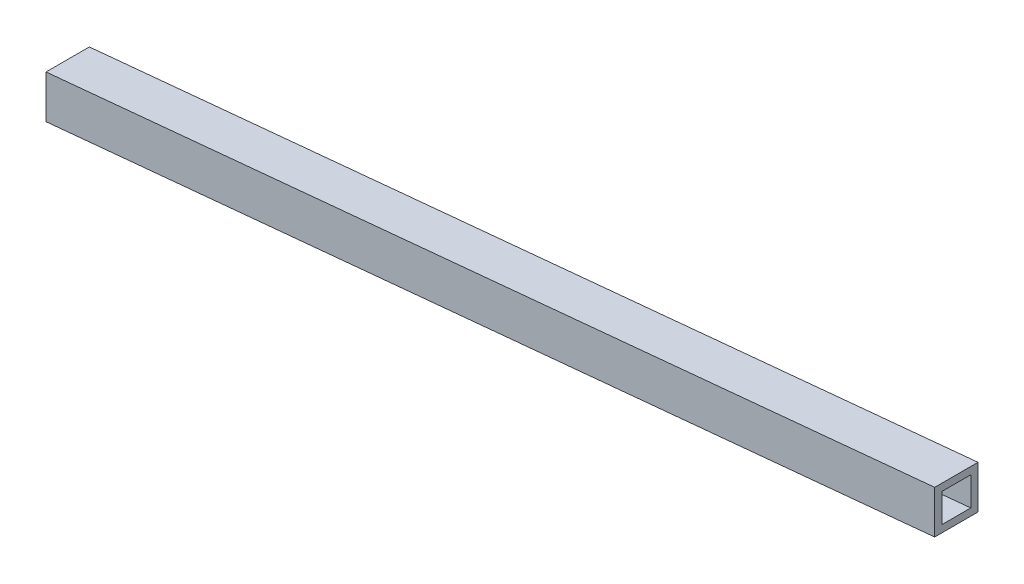
ISO-10303-21;
HEADER;
FILE_DESCRIPTION(('STEP AP214'),'2;1');
FILE_NAME('part.step','',(''),(''),'','','');
FILE_SCHEMA(('AUTOMOTIVE_DESIGN { 1 0 10303 214 1 1 1 1 }'));
ENDSEC;
DATA;
#1=APPLICATION_CONTEXT('core data for automotive mechanical design processes');
#2=APPLICATION_PROTOCOL_DEFINITION('international standard','automotive_design',2000,#1);
#3=PRODUCT_CONTEXT('',#1,'mechanical');
#4=PRODUCT('Part','Part','',(#3));
#5=PRODUCT_RELATED_PRODUCT_CATEGORY('part','',(#4));
#6=PRODUCT_DEFINITION_FORMATION('','',#4);
#7=PRODUCT_DEFINITION_CONTEXT('part definition',#1,'design');
#8=PRODUCT_DEFINITION('design','',#6,#7);
#9=PRODUCT_DEFINITION_SHAPE('','',#8);
#10=(LENGTH_UNIT() NAMED_UNIT(*) SI_UNIT(.MILLI.,.METRE.));
#11=(NAMED_UNIT(*) PLANE_ANGLE_UNIT() SI_UNIT($,.RADIAN.));
#12=(NAMED_UNIT(*) SI_UNIT($,.STERADIAN.) SOLID_ANGLE_UNIT());
#13=UNCERTAINTY_MEASURE_WITH_UNIT(LENGTH_MEASURE(1.E-05),#10,'distance_accuracy_value','');
#14=(GEOMETRIC_REPRESENTATION_CONTEXT(3) GLOBAL_UNCERTAINTY_ASSIGNED_CONTEXT((#13)) GLOBAL_UNIT_ASSIGNED_CONTEXT((#10,
#11,#12)) REPRESENTATION_CONTEXT('',''));
#15=CARTESIAN_POINT('',(0.,0.,0.));
#16=DIRECTION('',(0.,0.,1.));
#17=DIRECTION('',(1.,0.,0.));
#18=AXIS2_PLACEMENT_3D('',#15,#16,#17);
#19=CARTESIAN_POINT('',(0.,3.175,0.));
#20=DIRECTION('',(0.,1.,0.));
#21=DIRECTION('',(0.,0.,1.));
#22=AXIS2_PLACEMENT_3D('',#19,#20,#21);
#23=PLANE('',#22);
#24=DIRECTION('',(0.994505452921406,0.,-0.104684784518043));
#25=VECTOR('',#24,1.);
#26=CARTESIAN_POINT('',(-0.332374190844786,3.175,-3.15755481302547));
#27=LINE('',#26,#25);
#28=CARTESIAN_POINT('',(0.,3.175,-3.1925415699565));
#29=VERTEX_POINT('',#28);
#30=CARTESIAN_POINT('',(355.6,3.175,-40.624120517325));
#31=VERTEX_POINT('',#30);
#32=EDGE_CURVE('E80',#29,#31,#27,.T.);
#33=ORIENTED_EDGE('',*,*,#32,.T.);
#34=DIRECTION('',(0.,0.,1.));
#35=VECTOR('',#34,1.);
#36=CARTESIAN_POINT('',(355.6,3.175,0.));
#37=LINE('',#36,#35);
#38=CARTESIAN_POINT('',(355.6,3.175,-53.394286797151));
#39=VERTEX_POINT('',#38);
#40=EDGE_CURVE('E179',#39,#31,#37,.T.);
#41=ORIENTED_EDGE('',*,*,#40,.F.);
#42=DIRECTION('',(-0.994505452921406,0.,0.104684784518043));
#43=VECTOR('',#42,1.);
#44=CARTESIAN_POINT('',(-1.66187095422393,3.175,-15.7877740651273));
#45=LINE('',#44,#43);
#46=CARTESIAN_POINT('',(0.,3.175,-15.9627078497824));
#47=VERTEX_POINT('',#46);
#48=EDGE_CURVE('E168',#39,#47,#45,.T.);
#49=ORIENTED_EDGE('',*,*,#48,.T.);
#50=DIRECTION('',(0.,0.,-1.));
#51=VECTOR('',#50,1.);
#52=CARTESIAN_POINT('',(0.,3.175,0.));
#53=LINE('',#52,#51);
#54=EDGE_CURVE('E66',#29,#47,#53,.T.);
#55=ORIENTED_EDGE('',*,*,#54,.F.);
#56=EDGE_LOOP('',(#33,#41,#49,#55));
#57=FACE_BOUND('',#56,.T.);
#58=ADVANCED_FACE('F62',(#57),#23,.T.);
#59=CARTESIAN_POINT('',(0.,3.175,0.));
#60=DIRECTION('',(0.104684784518043,0.,0.994505452921406));
#61=DIRECTION('',(0.994505452921406,0.,-0.104684784518043));
#62=AXIS2_PLACEMENT_3D('',#59,#60,#61);
#63=PLANE('',#62);
#64=DIRECTION('',(-0.994505452921406,0.,0.104684784518043));
#65=VECTOR('',#64,1.);
#66=CARTESIAN_POINT('',(0.,0.,0.));
#67=LINE('',#66,#65);
#68=CARTESIAN_POINT('',(355.6,0.,-37.4315789473684));
#69=VERTEX_POINT('',#68);
#70=CARTESIAN_POINT('',(0.,0.,0.));
#71=VERTEX_POINT('',#70);
#72=EDGE_CURVE('E133',#69,#71,#67,.T.);
#73=ORIENTED_EDGE('',*,*,#72,.F.);
#74=DIRECTION('',(0.,-1.,0.));
#75=VECTOR('',#74,1.);
#76=CARTESIAN_POINT('',(355.6,3.175,-37.4315789473684));
#77=LINE('',#76,#75);
#78=CARTESIAN_POINT('',(355.6,19.05,-37.4315789473684));
#79=VERTEX_POINT('',#78);
#80=EDGE_CURVE('E12',#79,#69,#77,.T.);
#81=ORIENTED_EDGE('',*,*,#80,.F.);
#82=DIRECTION('',(0.994505452921406,0.,-0.104684784518043));
#83=VECTOR('',#82,1.);
#84=CARTESIAN_POINT('',(0.,19.05,0.));
#85=LINE('',#84,#83);
#86=CARTESIAN_POINT('',(0.,19.05,0.));
#87=VERTEX_POINT('',#86);
#88=EDGE_CURVE('E131',#87,#79,#85,.T.);
#89=ORIENTED_EDGE('',*,*,#88,.F.);
#90=DIRECTION('',(0.,-1.,0.));
#91=VECTOR('',#90,1.);
#92=CARTESIAN_POINT('',(0.,3.175,0.));
#93=LINE('',#92,#91);
#94=EDGE_CURVE('E200',#87,#71,#93,.T.);
#95=ORIENTED_EDGE('',*,*,#94,.T.);
#96=EDGE_LOOP('',(#73,#81,#89,#95));
#97=FACE_BOUND('',#96,.T.);
#98=ADVANCED_FACE('F64',(#97),#63,.T.);
#99=CARTESIAN_POINT('',(355.6,3.175,0.));
#100=DIRECTION('',(1.,0.,0.));
#101=DIRECTION('',(0.,0.,-1.));
#102=AXIS2_PLACEMENT_3D('',#99,#100,#101);
#103=PLANE('',#102);
#104=DIRECTION('',(0.,-1.,0.));
#105=VECTOR('',#104,1.);
#106=CARTESIAN_POINT('',(355.6,3.175,-56.5868283671075));
#107=LINE('',#106,#105);
#108=CARTESIAN_POINT('',(355.6,19.05,-56.5868283671075));
#109=VERTEX_POINT('',#108);
#110=CARTESIAN_POINT('',(355.6,0.,-56.5868283671075));
#111=VERTEX_POINT('',#110);
#112=EDGE_CURVE('E72',#109,#111,#107,.T.);
#113=ORIENTED_EDGE('',*,*,#112,.F.);
#114=DIRECTION('',(0.,0.,-1.));
#115=VECTOR('',#114,1.);
#116=CARTESIAN_POINT('',(355.6,19.05,-56.5868283671075));
#117=LINE('',#116,#115);
#118=EDGE_CURVE('E138',#79,#109,#117,.T.);
#119=ORIENTED_EDGE('',*,*,#118,.F.);
#120=ORIENTED_EDGE('',*,*,#80,.T.);
#121=DIRECTION('',(0.,0.,1.));
#122=VECTOR('',#121,1.);
#123=CARTESIAN_POINT('',(355.6,0.,0.));
#124=LINE('',#123,#122);
#125=EDGE_CURVE('E187',#111,#69,#124,.T.);
#126=ORIENTED_EDGE('',*,*,#125,.F.);
#127=EDGE_LOOP('',(#113,#119,#120,#126));
#128=FACE_BOUND('',#127,.T.);
#129=DIRECTION('',(0.,0.,-1.));
#130=VECTOR('',#129,1.);
#131=CARTESIAN_POINT('',(355.6,15.875,-56.5868283671075));
#132=LINE('',#131,#130);
#133=CARTESIAN_POINT('',(355.6,15.875,-40.624120517325));
#134=VERTEX_POINT('',#133);
#135=CARTESIAN_POINT('',(355.6,15.875,-53.394286797151));
#136=VERTEX_POINT('',#135);
#137=EDGE_CURVE('E153',#134,#136,#132,.T.);
#138=ORIENTED_EDGE('',*,*,#137,.T.);
#139=DIRECTION('',(0.,-1.,0.));
#140=VECTOR('',#139,1.);
#141=CARTESIAN_POINT('',(355.6,15.875,-53.394286797151));
#142=LINE('',#141,#140);
#143=EDGE_CURVE('E181',#136,#39,#142,.T.);
#144=ORIENTED_EDGE('',*,*,#143,.T.);
#145=ORIENTED_EDGE('',*,*,#40,.T.);
#146=DIRECTION('',(0.,-1.,0.));
#147=VECTOR('',#146,1.);
#148=CARTESIAN_POINT('',(355.6,15.875,-40.624120517325));
#149=LINE('',#148,#147);
#150=EDGE_CURVE('E163',#134,#31,#149,.T.);
#151=ORIENTED_EDGE('',*,*,#150,.F.);
#152=EDGE_LOOP('',(#138,#144,#145,#151));
#153=FACE_BOUND('',#152,.T.);
#154=ADVANCED_FACE('F139',(#128,#153),#103,.T.);
#155=CARTESIAN_POINT('',(-1.99424514506872,3.175,-18.9453288781528));
#156=DIRECTION('',(-0.104684784518043,0.,-0.994505452921406));
#157=DIRECTION('',(-0.994505452921406,0.,0.104684784518043));
#158=AXIS2_PLACEMENT_3D('',#155,#156,#157);
#159=PLANE('',#158);
#160=DIRECTION('',(0.994505452921406,0.,-0.104684784518043));
#161=VECTOR('',#160,1.);
#162=CARTESIAN_POINT('',(-1.99424514506872,0.,-18.9453288781528));
#163=LINE('',#162,#161);
#164=CARTESIAN_POINT('',(0.,0.,-19.155249419739));
#165=VERTEX_POINT('',#164);
#166=EDGE_CURVE('E192',#165,#111,#163,.T.);
#167=ORIENTED_EDGE('',*,*,#166,.F.);
#168=DIRECTION('',(0.,-1.,0.));
#169=VECTOR('',#168,1.);
#170=CARTESIAN_POINT('',(0.,3.175,-19.155249419739));
#171=LINE('',#170,#169);
#172=CARTESIAN_POINT('',(0.,19.05,-19.155249419739));
#173=VERTEX_POINT('',#172);
#174=EDGE_CURVE('E202',#173,#165,#171,.T.);
#175=ORIENTED_EDGE('',*,*,#174,.F.);
#176=DIRECTION('',(-0.994505452921406,0.,0.104684784518043));
#177=VECTOR('',#176,1.);
#178=CARTESIAN_POINT('',(355.6,19.05,-56.5868283671075));
#179=LINE('',#178,#177);
#180=EDGE_CURVE('E144',#109,#173,#179,.T.);
#181=ORIENTED_EDGE('',*,*,#180,.F.);
#182=ORIENTED_EDGE('',*,*,#112,.T.);
#183=EDGE_LOOP('',(#167,#175,#181,#182));
#184=FACE_BOUND('',#183,.T.);
#185=ADVANCED_FACE('F206',(#184),#159,.T.);
#186=CARTESIAN_POINT('',(0.,3.175,0.));
#187=DIRECTION('',(-1.,0.,0.));
#188=DIRECTION('',(0.,0.,1.));
#189=AXIS2_PLACEMENT_3D('',#186,#187,#188);
#190=PLANE('',#189);
#191=DIRECTION('',(0.,-1.,0.));
#192=VECTOR('',#191,1.);
#193=CARTESIAN_POINT('',(0.,15.875,-15.9627078497824));
#194=LINE('',#193,#192);
#195=CARTESIAN_POINT('',(0.,15.875,-15.9627078497824));
#196=VERTEX_POINT('',#195);
#197=EDGE_CURVE('E171',#196,#47,#194,.T.);
#198=ORIENTED_EDGE('',*,*,#197,.F.);
#199=DIRECTION('',(0.,0.,1.));
#200=VECTOR('',#199,1.);
#201=CARTESIAN_POINT('',(0.,15.875,0.));
#202=LINE('',#201,#200);
#203=CARTESIAN_POINT('',(0.,15.875,-3.1925415699565));
#204=VERTEX_POINT('',#203);
#205=EDGE_CURVE('E150',#196,#204,#202,.T.);
#206=ORIENTED_EDGE('',*,*,#205,.T.);
#207=DIRECTION('',(0.,-1.,0.));
#208=VECTOR('',#207,1.);
#209=CARTESIAN_POINT('',(0.,15.875,-3.1925415699565));
#210=LINE('',#209,#208);
#211=EDGE_CURVE('E166',#204,#29,#210,.T.);
#212=ORIENTED_EDGE('',*,*,#211,.T.);
#213=ORIENTED_EDGE('',*,*,#54,.T.);
#214=EDGE_LOOP('',(#198,#206,#212,#213));
#215=FACE_BOUND('',#214,.T.);
#216=DIRECTION('',(0.,0.,-1.));
#217=VECTOR('',#216,1.);
#218=CARTESIAN_POINT('',(0.,0.,0.));
#219=LINE('',#218,#217);
#220=EDGE_CURVE('E198',#71,#165,#219,.T.);
#221=ORIENTED_EDGE('',*,*,#220,.F.);
#222=ORIENTED_EDGE('',*,*,#94,.F.);
#223=DIRECTION('',(0.,0.,1.));
#224=VECTOR('',#223,1.);
#225=CARTESIAN_POINT('',(0.,19.05,0.));
#226=LINE('',#225,#224);
#227=EDGE_CURVE('E149',#173,#87,#226,.T.);
#228=ORIENTED_EDGE('',*,*,#227,.F.);
#229=ORIENTED_EDGE('',*,*,#174,.T.);
#230=EDGE_LOOP('',(#221,#222,#228,#229));
#231=FACE_BOUND('',#230,.T.);
#232=ADVANCED_FACE('F209',(#215,#231),#190,.T.);
#233=CARTESIAN_POINT('',(0.,0.,0.));
#234=DIRECTION('',(0.,1.,0.));
#235=DIRECTION('',(0.,0.,1.));
#236=AXIS2_PLACEMENT_3D('',#233,#234,#235);
#237=PLANE('',#236);
#238=ORIENTED_EDGE('',*,*,#72,.T.);
#239=ORIENTED_EDGE('',*,*,#220,.T.);
#240=ORIENTED_EDGE('',*,*,#166,.T.);
#241=ORIENTED_EDGE('',*,*,#125,.T.);
#242=EDGE_LOOP('',(#238,#239,#240,#241));
#243=FACE_BOUND('',#242,.T.);
#244=ADVANCED_FACE('F207',(#243),#237,.F.);
#245=CARTESIAN_POINT('',(-1.66187095422393,15.875,-15.7877740651273));
#246=DIRECTION('',(0.104684784518043,0.,0.994505452921406));
#247=DIRECTION('',(0.994505452921406,0.,-0.104684784518043));
#248=AXIS2_PLACEMENT_3D('',#245,#246,#247);
#249=PLANE('',#248);
#250=ORIENTED_EDGE('',*,*,#48,.F.);
#251=ORIENTED_EDGE('',*,*,#143,.F.);
#252=DIRECTION('',(-0.994505452921406,0.,0.104684784518043));
#253=VECTOR('',#252,1.);
#254=CARTESIAN_POINT('',(-1.66187095422393,15.875,-15.7877740651273));
#255=LINE('',#254,#253);
#256=EDGE_CURVE('E169',#136,#196,#255,.T.);
#257=ORIENTED_EDGE('',*,*,#256,.T.);
#258=ORIENTED_EDGE('',*,*,#197,.T.);
#259=EDGE_LOOP('',(#250,#251,#257,#258));
#260=FACE_BOUND('',#259,.T.);
#261=ADVANCED_FACE('F216',(#260),#249,.T.);
#262=CARTESIAN_POINT('',(-0.332374190844786,15.875,-3.15755481302547));
#263=DIRECTION('',(-0.104684784518043,0.,-0.994505452921406));
#264=DIRECTION('',(-0.994505452921406,0.,0.104684784518043));
#265=AXIS2_PLACEMENT_3D('',#262,#263,#264);
#266=PLANE('',#265);
#267=ORIENTED_EDGE('',*,*,#32,.F.);
#268=ORIENTED_EDGE('',*,*,#211,.F.);
#269=DIRECTION('',(0.994505452921406,0.,-0.104684784518043));
#270=VECTOR('',#269,1.);
#271=CARTESIAN_POINT('',(-0.332374190844786,15.875,-3.15755481302547));
#272=LINE('',#271,#270);
#273=EDGE_CURVE('E160',#204,#134,#272,.T.);
#274=ORIENTED_EDGE('',*,*,#273,.T.);
#275=ORIENTED_EDGE('',*,*,#150,.T.);
#276=EDGE_LOOP('',(#267,#268,#274,#275));
#277=FACE_BOUND('',#276,.T.);
#278=ADVANCED_FACE('F228',(#277),#266,.T.);
#279=CARTESIAN_POINT('',(0.,19.05,0.));
#280=DIRECTION('',(0.,-1.,0.));
#281=DIRECTION('',(0.,0.,-1.));
#282=AXIS2_PLACEMENT_3D('',#279,#280,#281);
#283=PLANE('',#282);
#284=ORIENTED_EDGE('',*,*,#88,.T.);
#285=ORIENTED_EDGE('',*,*,#118,.T.);
#286=ORIENTED_EDGE('',*,*,#180,.T.);
#287=ORIENTED_EDGE('',*,*,#227,.T.);
#288=EDGE_LOOP('',(#284,#285,#286,#287));
#289=FACE_BOUND('',#288,.T.);
#290=ADVANCED_FACE('F147',(#289),#283,.F.);
#291=CARTESIAN_POINT('',(0.,15.875,0.));
#292=DIRECTION('',(0.,-1.,0.));
#293=DIRECTION('',(0.,0.,-1.));
#294=AXIS2_PLACEMENT_3D('',#291,#292,#293);
#295=PLANE('',#294);
#296=ORIENTED_EDGE('',*,*,#205,.F.);
#297=ORIENTED_EDGE('',*,*,#256,.F.);
#298=ORIENTED_EDGE('',*,*,#137,.F.);
#299=ORIENTED_EDGE('',*,*,#273,.F.);
#300=EDGE_LOOP('',(#296,#297,#298,#299));
#301=FACE_BOUND('',#300,.T.);
#302=ADVANCED_FACE('F232',(#301),#295,.T.);
#303=CLOSED_SHELL('',(#58,#98,#154,#185,#232,#244,#261,#278,#290,#302));
#304=MANIFOLD_SOLID_BREP('B2',#303);
#305=ADVANCED_BREP_SHAPE_REPRESENTATION('',(#18,#304),#14);
#306=SHAPE_DEFINITION_REPRESENTATION(#9,#305);
ENDSEC;
END-ISO-10303-21;
